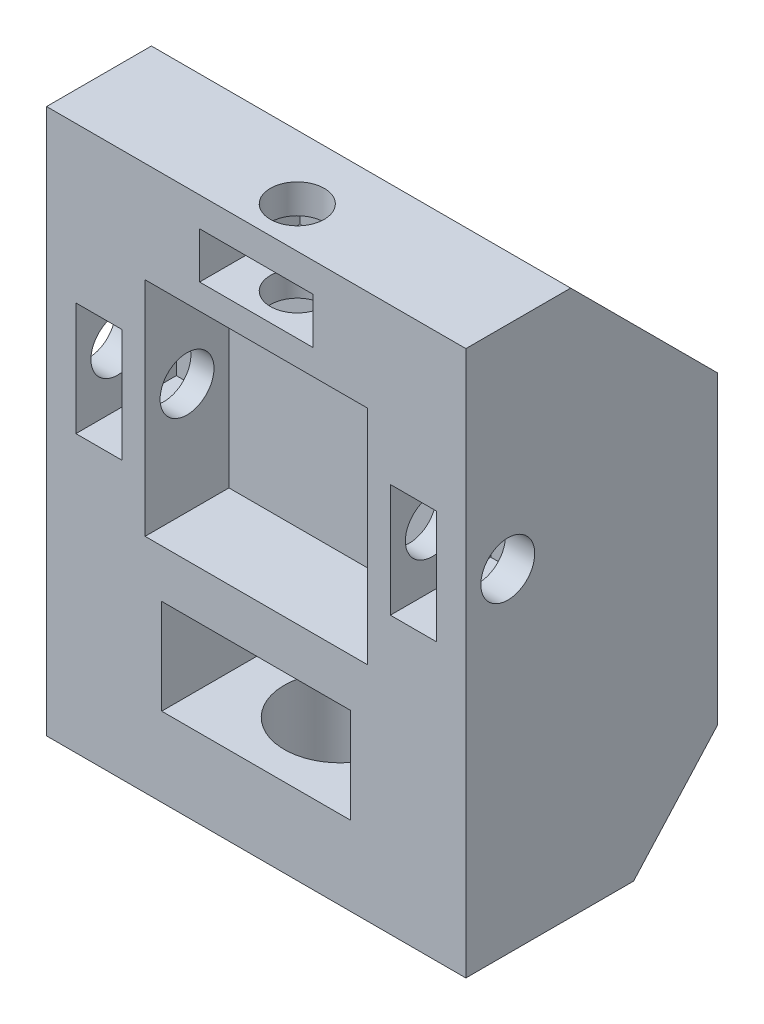
ISO-10303-21;
HEADER;
FILE_DESCRIPTION(('STEP AP214'),'2;1');
FILE_NAME('part.step','',(''),(''),'','','');
FILE_SCHEMA(('AUTOMOTIVE_DESIGN { 1 0 10303 214 1 1 1 1 }'));
ENDSEC;
DATA;
#1=APPLICATION_CONTEXT('core data for automotive mechanical design processes');
#2=APPLICATION_PROTOCOL_DEFINITION('international standard','automotive_design',2000,#1);
#3=PRODUCT_CONTEXT('',#1,'mechanical');
#4=PRODUCT('Part','Part','',(#3));
#5=PRODUCT_RELATED_PRODUCT_CATEGORY('part','',(#4));
#6=PRODUCT_DEFINITION_FORMATION('','',#4);
#7=PRODUCT_DEFINITION_CONTEXT('part definition',#1,'design');
#8=PRODUCT_DEFINITION('design','',#6,#7);
#9=PRODUCT_DEFINITION_SHAPE('','',#8);
#10=(LENGTH_UNIT() NAMED_UNIT(*) SI_UNIT(.MILLI.,.METRE.));
#11=(NAMED_UNIT(*) PLANE_ANGLE_UNIT() SI_UNIT($,.RADIAN.));
#12=(NAMED_UNIT(*) SI_UNIT($,.STERADIAN.) SOLID_ANGLE_UNIT());
#13=UNCERTAINTY_MEASURE_WITH_UNIT(LENGTH_MEASURE(1.E-05),#10,'distance_accuracy_value','');
#14=(GEOMETRIC_REPRESENTATION_CONTEXT(3) GLOBAL_UNCERTAINTY_ASSIGNED_CONTEXT((#13)) GLOBAL_UNIT_ASSIGNED_CONTEXT((#10,
#11,#12)) REPRESENTATION_CONTEXT('',''));
#15=CARTESIAN_POINT('',(0.,0.,0.));
#16=DIRECTION('',(0.,0.,1.));
#17=DIRECTION('',(1.,0.,0.));
#18=AXIS2_PLACEMENT_3D('',#15,#16,#17);
#19=CARTESIAN_POINT('',(12.7,3.67689972237439,12.7));
#20=DIRECTION('',(1.,0.,0.));
#21=DIRECTION('',(0.,0.,-1.));
#22=AXIS2_PLACEMENT_3D('',#19,#20,#21);
#23=CYLINDRICAL_SURFACE('',#22,1.63194999999999);
#24=CARTESIAN_POINT('',(-8.128,3.67689972237439,12.7));
#25=DIRECTION('',(1.,0.,0.));
#26=DIRECTION('',(0.,0.,-1.));
#27=AXIS2_PLACEMENT_3D('',#24,#25,#26);
#28=CIRCLE('',#27,1.63194999999999);
#29=CARTESIAN_POINT('',(-8.128,3.67689972237439,11.06805));
#30=VERTEX_POINT('',#29);
#31=EDGE_CURVE('E39',#30,#30,#28,.F.);
#32=ORIENTED_EDGE('',*,*,#31,.T.);
#33=EDGE_LOOP('',(#32));
#34=FACE_BOUND('',#33,.T.);
#35=CARTESIAN_POINT('',(-6.731,3.67689972237439,12.7));
#36=DIRECTION('',(-1.,0.,0.));
#37=DIRECTION('',(0.,0.,1.));
#38=AXIS2_PLACEMENT_3D('',#35,#36,#37);
#39=CIRCLE('',#38,1.63194999999999);
#40=CARTESIAN_POINT('',(-6.731,3.67689972237439,14.33195));
#41=VERTEX_POINT('',#40);
#42=EDGE_CURVE('E327',#41,#41,#39,.T.);
#43=ORIENTED_EDGE('',*,*,#42,.F.);
#44=EDGE_LOOP('',(#43));
#45=FACE_BOUND('',#44,.T.);
#46=ADVANCED_FACE('F35',(#34,#45),#23,.F.);
#47=CARTESIAN_POINT('',(10.922,3.67689972237439,12.7));
#48=DIRECTION('',(1.,0.,0.));
#49=DIRECTION('',(0.,0.,-1.));
#50=AXIS2_PLACEMENT_3D('',#47,#48,#49);
#51=CIRCLE('',#50,1.63194999999999);
#52=CARTESIAN_POINT('',(10.922,3.67689972237439,11.06805));
#53=VERTEX_POINT('',#52);
#54=EDGE_CURVE('E303',#53,#53,#51,.F.);
#55=ORIENTED_EDGE('',*,*,#54,.T.);
#56=EDGE_LOOP('',(#55));
#57=FACE_BOUND('',#56,.T.);
#58=CARTESIAN_POINT('',(12.7,3.67689972237439,12.7));
#59=DIRECTION('',(1.,0.,0.));
#60=DIRECTION('',(0.,0.,-1.));
#61=AXIS2_PLACEMENT_3D('',#58,#59,#60);
#62=CIRCLE('',#61,1.63194999999999);
#63=CARTESIAN_POINT('',(12.7,3.67689972237439,11.06805));
#64=VERTEX_POINT('',#63);
#65=EDGE_CURVE('E320',#64,#64,#62,.T.);
#66=ORIENTED_EDGE('',*,*,#65,.T.);
#67=EDGE_LOOP('',(#66));
#68=FACE_BOUND('',#67,.T.);
#69=ADVANCED_FACE('F485',(#57,#68),#23,.F.);
#70=CARTESIAN_POINT('',(0.,16.51,12.7522595707275));
#71=DIRECTION('',(0.,1.,0.));
#72=DIRECTION('',(0.,0.,1.));
#73=AXIS2_PLACEMENT_3D('',#70,#71,#72);
#74=CYLINDRICAL_SURFACE('',#73,1.63195);
#75=CARTESIAN_POINT('',(0.,11.938,12.7522595707275));
#76=DIRECTION('',(0.,-1.,0.));
#77=DIRECTION('',(0.,0.,-1.));
#78=AXIS2_PLACEMENT_3D('',#75,#76,#77);
#79=CIRCLE('',#78,1.63195);
#80=CARTESIAN_POINT('',(0.,11.938,11.1203095707275));
#81=VERTEX_POINT('',#80);
#82=EDGE_CURVE('E324',#81,#81,#79,.F.);
#83=ORIENTED_EDGE('',*,*,#82,.T.);
#84=EDGE_LOOP('',(#83));
#85=FACE_BOUND('',#84,.T.);
#86=CARTESIAN_POINT('',(0.,10.4078997223744,12.7522595707275));
#87=DIRECTION('',(0.,1.,0.));
#88=DIRECTION('',(-1.,0.,0.));
#89=AXIS2_PLACEMENT_3D('',#86,#87,#88);
#90=CIRCLE('',#89,1.63195);
#91=CARTESIAN_POINT('',(-1.63195,10.4078997223744,12.7522595707275));
#92=VERTEX_POINT('',#91);
#93=EDGE_CURVE('E336',#92,#92,#90,.T.);
#94=ORIENTED_EDGE('',*,*,#93,.F.);
#95=EDGE_LOOP('',(#94));
#96=FACE_BOUND('',#95,.T.);
#97=ADVANCED_FACE('F491',(#85,#96),#74,.F.);
#98=CARTESIAN_POINT('',(-12.7,-16.51,15.24));
#99=DIRECTION('',(1.,0.,0.));
#100=DIRECTION('',(0.,1.,0.));
#101=AXIS2_PLACEMENT_3D('',#98,#99,#100);
#102=PLANE('',#101);
#103=CARTESIAN_POINT('',(-12.7,3.67689972237439,12.7));
#104=DIRECTION('',(1.,0.,0.));
#105=DIRECTION('',(0.,0.,-1.));
#106=AXIS2_PLACEMENT_3D('',#103,#104,#105);
#107=CIRCLE('',#106,1.63194999999999);
#108=CARTESIAN_POINT('',(-12.7,3.67689972237439,11.06805));
#109=VERTEX_POINT('',#108);
#110=EDGE_CURVE('E323',#109,#109,#107,.T.);
#111=ORIENTED_EDGE('',*,*,#110,.T.);
#112=EDGE_LOOP('',(#111));
#113=FACE_BOUND('',#112,.T.);
#114=DIRECTION('',(0.,0.,-1.));
#115=VECTOR('',#114,1.);
#116=CARTESIAN_POINT('',(-12.7,16.51,15.24));
#117=LINE('',#116,#115);
#118=CARTESIAN_POINT('',(-12.7,16.51,15.24));
#119=VERTEX_POINT('',#118);
#120=CARTESIAN_POINT('',(-12.7,16.51,8.89));
#121=VERTEX_POINT('',#120);
#122=EDGE_CURVE('E416',#119,#121,#117,.T.);
#123=ORIENTED_EDGE('',*,*,#122,.T.);
#124=DIRECTION('',(0.,-0.707106781186549,-0.707106781186546));
#125=VECTOR('',#124,1.);
#126=CARTESIAN_POINT('',(-12.7,16.51,8.89));
#127=LINE('',#126,#125);
#128=CARTESIAN_POINT('',(-12.7,7.61999999999998,0.));
#129=VERTEX_POINT('',#128);
#130=EDGE_CURVE('E452',#121,#129,#127,.T.);
#131=ORIENTED_EDGE('',*,*,#130,.T.);
#132=DIRECTION('',(0.,-1.,0.));
#133=VECTOR('',#132,1.);
#134=CARTESIAN_POINT('',(-12.7,-16.51,0.));
#135=LINE('',#134,#133);
#136=CARTESIAN_POINT('',(-12.7,-10.8680884246676,0.));
#137=VERTEX_POINT('',#136);
#138=EDGE_CURVE('E399',#129,#137,#135,.T.);
#139=ORIENTED_EDGE('',*,*,#138,.T.);
#140=DIRECTION('',(0.,-0.743144825477398,0.669130606358854));
#141=VECTOR('',#140,1.);
#142=CARTESIAN_POINT('',(-12.7,-16.51,5.08000000000004));
#143=LINE('',#142,#141);
#144=CARTESIAN_POINT('',(-12.7,-16.51,5.08000000000004));
#145=VERTEX_POINT('',#144);
#146=EDGE_CURVE('E447',#137,#145,#143,.T.);
#147=ORIENTED_EDGE('',*,*,#146,.T.);
#148=DIRECTION('',(0.,0.,-1.));
#149=VECTOR('',#148,1.);
#150=CARTESIAN_POINT('',(-12.7,-16.51,15.24));
#151=LINE('',#150,#149);
#152=CARTESIAN_POINT('',(-12.7,-16.51,15.24));
#153=VERTEX_POINT('',#152);
#154=EDGE_CURVE('E428',#153,#145,#151,.T.);
#155=ORIENTED_EDGE('',*,*,#154,.F.);
#156=DIRECTION('',(0.,-1.,0.));
#157=VECTOR('',#156,1.);
#158=CARTESIAN_POINT('',(-12.7,-16.51,15.24));
#159=LINE('',#158,#157);
#160=EDGE_CURVE('E406',#119,#153,#159,.T.);
#161=ORIENTED_EDGE('',*,*,#160,.F.);
#162=EDGE_LOOP('',(#123,#131,#139,#147,#155,#161));
#163=FACE_BOUND('',#162,.T.);
#164=ADVANCED_FACE('F563',(#113,#163),#102,.F.);
#165=CARTESIAN_POINT('',(-12.7,-16.51,15.24));
#166=DIRECTION('',(0.,1.,0.));
#167=DIRECTION('',(0.,0.,1.));
#168=AXIS2_PLACEMENT_3D('',#165,#166,#167);
#169=PLANE('',#168);
#170=CARTESIAN_POINT('',(0.,-16.51,10.16));
#171=DIRECTION('',(0.,-1.,0.));
#172=DIRECTION('',(0.,0.,-1.));
#173=AXIS2_PLACEMENT_3D('',#170,#171,#172);
#174=CIRCLE('',#173,3.37819999999999);
#175=CARTESIAN_POINT('',(0.,-16.51,6.78180000000001));
#176=VERTEX_POINT('',#175);
#177=EDGE_CURVE('E339',#176,#176,#174,.T.);
#178=ORIENTED_EDGE('',*,*,#177,.F.);
#179=EDGE_LOOP('',(#178));
#180=FACE_BOUND('',#179,.T.);
#181=ORIENTED_EDGE('',*,*,#154,.T.);
#182=DIRECTION('',(1.,0.,0.));
#183=VECTOR('',#182,1.);
#184=CARTESIAN_POINT('',(12.7,-16.51,5.08000000000004));
#185=LINE('',#184,#183);
#186=CARTESIAN_POINT('',(12.7,-16.51,5.08000000000004));
#187=VERTEX_POINT('',#186);
#188=EDGE_CURVE('E431',#145,#187,#185,.T.);
#189=ORIENTED_EDGE('',*,*,#188,.T.);
#190=DIRECTION('',(0.,0.,-1.));
#191=VECTOR('',#190,1.);
#192=CARTESIAN_POINT('',(12.7,-16.51,15.24));
#193=LINE('',#192,#191);
#194=CARTESIAN_POINT('',(12.7,-16.51,15.24));
#195=VERTEX_POINT('',#194);
#196=EDGE_CURVE('E425',#195,#187,#193,.T.);
#197=ORIENTED_EDGE('',*,*,#196,.F.);
#198=DIRECTION('',(1.,0.,0.));
#199=VECTOR('',#198,1.);
#200=CARTESIAN_POINT('',(-12.7,-16.51,15.24));
#201=LINE('',#200,#199);
#202=EDGE_CURVE('E409',#153,#195,#201,.T.);
#203=ORIENTED_EDGE('',*,*,#202,.F.);
#204=EDGE_LOOP('',(#181,#189,#197,#203));
#205=FACE_BOUND('',#204,.T.);
#206=ADVANCED_FACE('F559',(#180,#205),#169,.F.);
#207=CARTESIAN_POINT('',(12.7,-16.51,15.24));
#208=DIRECTION('',(-1.,0.,0.));
#209=DIRECTION('',(0.,-1.,0.));
#210=AXIS2_PLACEMENT_3D('',#207,#208,#209);
#211=PLANE('',#210);
#212=ORIENTED_EDGE('',*,*,#65,.F.);
#213=EDGE_LOOP('',(#212));
#214=FACE_BOUND('',#213,.T.);
#215=DIRECTION('',(0.,1.,0.));
#216=VECTOR('',#215,1.);
#217=CARTESIAN_POINT('',(12.7,-16.51,0.));
#218=LINE('',#217,#216);
#219=CARTESIAN_POINT('',(12.7,-10.8680884246676,0.));
#220=VERTEX_POINT('',#219);
#221=CARTESIAN_POINT('',(12.7,7.61999999999998,0.));
#222=VERTEX_POINT('',#221);
#223=EDGE_CURVE('E410',#220,#222,#218,.T.);
#224=ORIENTED_EDGE('',*,*,#223,.T.);
#225=DIRECTION('',(0.,0.707106781186549,0.707106781186546));
#226=VECTOR('',#225,1.);
#227=CARTESIAN_POINT('',(12.7,16.51,8.89));
#228=LINE('',#227,#226);
#229=CARTESIAN_POINT('',(12.7,16.51,8.89));
#230=VERTEX_POINT('',#229);
#231=EDGE_CURVE('E11',#222,#230,#228,.T.);
#232=ORIENTED_EDGE('',*,*,#231,.T.);
#233=DIRECTION('',(0.,0.,-1.));
#234=VECTOR('',#233,1.);
#235=CARTESIAN_POINT('',(12.7,16.51,15.24));
#236=LINE('',#235,#234);
#237=CARTESIAN_POINT('',(12.7,16.51,15.24));
#238=VERTEX_POINT('',#237);
#239=EDGE_CURVE('E422',#238,#230,#236,.T.);
#240=ORIENTED_EDGE('',*,*,#239,.F.);
#241=DIRECTION('',(0.,1.,0.));
#242=VECTOR('',#241,1.);
#243=CARTESIAN_POINT('',(12.7,-16.51,15.24));
#244=LINE('',#243,#242);
#245=EDGE_CURVE('E412',#195,#238,#244,.T.);
#246=ORIENTED_EDGE('',*,*,#245,.F.);
#247=ORIENTED_EDGE('',*,*,#196,.T.);
#248=DIRECTION('',(0.,0.743144825477398,-0.669130606358854));
#249=VECTOR('',#248,1.);
#250=CARTESIAN_POINT('',(12.7,-16.51,5.08000000000004));
#251=LINE('',#250,#249);
#252=EDGE_CURVE('E434',#187,#220,#251,.T.);
#253=ORIENTED_EDGE('',*,*,#252,.T.);
#254=EDGE_LOOP('',(#224,#232,#240,#246,#247,#253));
#255=FACE_BOUND('',#254,.T.);
#256=ADVANCED_FACE('F555',(#214,#255),#211,.F.);
#257=CARTESIAN_POINT('',(-12.7,16.51,15.24));
#258=DIRECTION('',(0.,-1.,0.));
#259=DIRECTION('',(0.,0.,-1.));
#260=AXIS2_PLACEMENT_3D('',#257,#258,#259);
#261=PLANE('',#260);
#262=CARTESIAN_POINT('',(0.,16.51,12.7522595707275));
#263=DIRECTION('',(0.,1.,0.));
#264=DIRECTION('',(0.,0.,1.));
#265=AXIS2_PLACEMENT_3D('',#262,#263,#264);
#266=CIRCLE('',#265,1.63195);
#267=CARTESIAN_POINT('',(0.,16.51,14.3842095707275));
#268=VERTEX_POINT('',#267);
#269=EDGE_CURVE('E333',#268,#268,#266,.T.);
#270=ORIENTED_EDGE('',*,*,#269,.F.);
#271=EDGE_LOOP('',(#270));
#272=FACE_BOUND('',#271,.T.);
#273=ORIENTED_EDGE('',*,*,#239,.T.);
#274=DIRECTION('',(-1.,0.,0.));
#275=VECTOR('',#274,1.);
#276=CARTESIAN_POINT('',(-12.7,16.51,8.89));
#277=LINE('',#276,#275);
#278=EDGE_CURVE('E449',#230,#121,#277,.T.);
#279=ORIENTED_EDGE('',*,*,#278,.T.);
#280=ORIENTED_EDGE('',*,*,#122,.F.);
#281=DIRECTION('',(-1.,0.,0.));
#282=VECTOR('',#281,1.);
#283=CARTESIAN_POINT('',(-12.7,16.51,15.24));
#284=LINE('',#283,#282);
#285=EDGE_CURVE('E414',#238,#119,#284,.T.);
#286=ORIENTED_EDGE('',*,*,#285,.F.);
#287=EDGE_LOOP('',(#273,#279,#280,#286));
#288=FACE_BOUND('',#287,.T.);
#289=ADVANCED_FACE('F548',(#272,#288),#261,.F.);
#290=CARTESIAN_POINT('',(0.,0.,15.24));
#291=DIRECTION('',(0.,0.,-1.));
#292=DIRECTION('',(-1.,0.,0.));
#293=AXIS2_PLACEMENT_3D('',#290,#291,#292);
#294=PLANE('',#293);
#295=DIRECTION('',(-1.,0.,0.));
#296=VECTOR('',#295,1.);
#297=CARTESIAN_POINT('',(-10.922,7.09605718062982,15.24));
#298=LINE('',#297,#296);
#299=CARTESIAN_POINT('',(-8.128,7.09605718062982,15.24));
#300=VERTEX_POINT('',#299);
#301=CARTESIAN_POINT('',(-10.922,7.09605718062982,15.24));
#302=VERTEX_POINT('',#301);
#303=EDGE_CURVE('E245',#300,#302,#298,.T.);
#304=ORIENTED_EDGE('',*,*,#303,.F.);
#305=DIRECTION('',(0.,1.,0.));
#306=VECTOR('',#305,1.);
#307=CARTESIAN_POINT('',(-8.128,0.238057180629819,15.24));
#308=LINE('',#307,#306);
#309=CARTESIAN_POINT('',(-8.128,0.238057180629819,15.24));
#310=VERTEX_POINT('',#309);
#311=EDGE_CURVE('E52',#310,#300,#308,.T.);
#312=ORIENTED_EDGE('',*,*,#311,.F.);
#313=DIRECTION('',(1.,0.,0.));
#314=VECTOR('',#313,1.);
#315=CARTESIAN_POINT('',(-10.922,0.238057180629819,15.24));
#316=LINE('',#315,#314);
#317=CARTESIAN_POINT('',(-10.922,0.238057180629819,15.24));
#318=VERTEX_POINT('',#317);
#319=EDGE_CURVE('E236',#318,#310,#316,.T.);
#320=ORIENTED_EDGE('',*,*,#319,.F.);
#321=DIRECTION('',(0.,-1.,0.));
#322=VECTOR('',#321,1.);
#323=CARTESIAN_POINT('',(-10.922,0.238057180629819,15.24));
#324=LINE('',#323,#322);
#325=EDGE_CURVE('E239',#302,#318,#324,.T.);
#326=ORIENTED_EDGE('',*,*,#325,.F.);
#327=EDGE_LOOP('',(#304,#312,#320,#326));
#328=FACE_BOUND('',#327,.T.);
#329=DIRECTION('',(-1.,0.,0.));
#330=VECTOR('',#329,1.);
#331=CARTESIAN_POINT('',(8.12800000000001,7.09605718062982,15.24));
#332=LINE('',#331,#330);
#333=CARTESIAN_POINT('',(10.922,7.09605718062982,15.24));
#334=VERTEX_POINT('',#333);
#335=CARTESIAN_POINT('',(8.12800000000001,7.09605718062982,15.24));
#336=VERTEX_POINT('',#335);
#337=EDGE_CURVE('E270',#334,#336,#332,.T.);
#338=ORIENTED_EDGE('',*,*,#337,.F.);
#339=DIRECTION('',(0.,1.,0.));
#340=VECTOR('',#339,1.);
#341=CARTESIAN_POINT('',(10.922,0.238057180629819,15.24));
#342=LINE('',#341,#340);
#343=CARTESIAN_POINT('',(10.922,0.238057180629819,15.24));
#344=VERTEX_POINT('',#343);
#345=EDGE_CURVE('E60',#344,#334,#342,.T.);
#346=ORIENTED_EDGE('',*,*,#345,.F.);
#347=DIRECTION('',(1.,0.,0.));
#348=VECTOR('',#347,1.);
#349=CARTESIAN_POINT('',(8.12800000000001,0.238057180629819,15.24));
#350=LINE('',#349,#348);
#351=CARTESIAN_POINT('',(8.12800000000001,0.238057180629819,15.24));
#352=VERTEX_POINT('',#351);
#353=EDGE_CURVE('E259',#352,#344,#350,.T.);
#354=ORIENTED_EDGE('',*,*,#353,.F.);
#355=DIRECTION('',(0.,-1.,0.));
#356=VECTOR('',#355,1.);
#357=CARTESIAN_POINT('',(8.12800000000001,0.238057180629819,15.24));
#358=LINE('',#357,#356);
#359=EDGE_CURVE('E273',#336,#352,#358,.T.);
#360=ORIENTED_EDGE('',*,*,#359,.F.);
#361=EDGE_LOOP('',(#338,#346,#354,#360));
#362=FACE_BOUND('',#361,.T.);
#363=DIRECTION('',(-1.,0.,0.));
#364=VECTOR('',#363,1.);
#365=CARTESIAN_POINT('',(-3.42899999999999,14.732,15.24));
#366=LINE('',#365,#364);
#367=CARTESIAN_POINT('',(3.42900000000001,14.732,15.24));
#368=VERTEX_POINT('',#367);
#369=CARTESIAN_POINT('',(-3.42899999999999,14.732,15.24));
#370=VERTEX_POINT('',#369);
#371=EDGE_CURVE('E302',#368,#370,#366,.T.);
#372=ORIENTED_EDGE('',*,*,#371,.F.);
#373=DIRECTION('',(0.,1.,0.));
#374=VECTOR('',#373,1.);
#375=CARTESIAN_POINT('',(3.42900000000001,11.938,15.24));
#376=LINE('',#375,#374);
#377=CARTESIAN_POINT('',(3.42900000000001,11.938,15.24));
#378=VERTEX_POINT('',#377);
#379=EDGE_CURVE('E300',#378,#368,#376,.T.);
#380=ORIENTED_EDGE('',*,*,#379,.F.);
#381=DIRECTION('',(1.,0.,0.));
#382=VECTOR('',#381,1.);
#383=CARTESIAN_POINT('',(-3.42899999999999,11.938,15.24));
#384=LINE('',#383,#382);
#385=CARTESIAN_POINT('',(-3.42899999999999,11.938,15.24));
#386=VERTEX_POINT('',#385);
#387=EDGE_CURVE('E290',#386,#378,#384,.T.);
#388=ORIENTED_EDGE('',*,*,#387,.F.);
#389=DIRECTION('',(0.,-1.,0.));
#390=VECTOR('',#389,1.);
#391=CARTESIAN_POINT('',(-3.42899999999999,11.938,15.24));
#392=LINE('',#391,#390);
#393=EDGE_CURVE('E306',#370,#386,#392,.T.);
#394=ORIENTED_EDGE('',*,*,#393,.F.);
#395=EDGE_LOOP('',(#372,#380,#388,#394));
#396=FACE_BOUND('',#395,.T.);
#397=DIRECTION('',(-1.,0.,0.));
#398=VECTOR('',#397,1.);
#399=CARTESIAN_POINT('',(-5.72652120523289,-5.96281055176047,15.24));
#400=LINE('',#399,#398);
#401=CARTESIAN_POINT('',(5.72652120523289,-5.96281055176047,15.24));
#402=VERTEX_POINT('',#401);
#403=CARTESIAN_POINT('',(-5.72652120523289,-5.96281055176047,15.24));
#404=VERTEX_POINT('',#403);
#405=EDGE_CURVE('E357',#402,#404,#400,.T.);
#406=ORIENTED_EDGE('',*,*,#405,.F.);
#407=DIRECTION('',(0.,1.,0.));
#408=VECTOR('',#407,1.);
#409=CARTESIAN_POINT('',(5.72652120523289,-5.96281055176047,15.24));
#410=LINE('',#409,#408);
#411=CARTESIAN_POINT('',(5.72652120523289,-11.72534761363,15.24));
#412=VERTEX_POINT('',#411);
#413=EDGE_CURVE('E345',#412,#402,#410,.T.);
#414=ORIENTED_EDGE('',*,*,#413,.F.);
#415=DIRECTION('',(1.,0.,0.));
#416=VECTOR('',#415,1.);
#417=CARTESIAN_POINT('',(-5.72652120523289,-11.72534761363,15.24));
#418=LINE('',#417,#416);
#419=CARTESIAN_POINT('',(-5.72652120523289,-11.72534761363,15.24));
#420=VERTEX_POINT('',#419);
#421=EDGE_CURVE('E349',#420,#412,#418,.T.);
#422=ORIENTED_EDGE('',*,*,#421,.F.);
#423=DIRECTION('',(0.,-1.,0.));
#424=VECTOR('',#423,1.);
#425=CARTESIAN_POINT('',(-5.72652120523289,-5.96281055176047,15.24));
#426=LINE('',#425,#424);
#427=EDGE_CURVE('E360',#404,#420,#426,.T.);
#428=ORIENTED_EDGE('',*,*,#427,.F.);
#429=EDGE_LOOP('',(#406,#414,#422,#428));
#430=FACE_BOUND('',#429,.T.);
#431=DIRECTION('',(-1.,0.,0.));
#432=VECTOR('',#431,1.);
#433=CARTESIAN_POINT('',(-6.731,10.4078997223744,15.24));
#434=LINE('',#433,#432);
#435=CARTESIAN_POINT('',(6.731,10.4078997223744,15.24));
#436=VERTEX_POINT('',#435);
#437=CARTESIAN_POINT('',(-6.731,10.4078997223744,15.24));
#438=VERTEX_POINT('',#437);
#439=EDGE_CURVE('E389',#436,#438,#434,.T.);
#440=ORIENTED_EDGE('',*,*,#439,.F.);
#441=DIRECTION('',(0.,1.,0.));
#442=VECTOR('',#441,1.);
#443=CARTESIAN_POINT('',(6.731,-3.05410027762562,15.24));
#444=LINE('',#443,#442);
#445=CARTESIAN_POINT('',(6.731,-3.05410027762562,15.24));
#446=VERTEX_POINT('',#445);
#447=EDGE_CURVE('E367',#446,#436,#444,.T.);
#448=ORIENTED_EDGE('',*,*,#447,.F.);
#449=DIRECTION('',(1.,0.,0.));
#450=VECTOR('',#449,1.);
#451=CARTESIAN_POINT('',(-6.731,-3.05410027762562,15.24));
#452=LINE('',#451,#450);
#453=CARTESIAN_POINT('',(-6.731,-3.05410027762562,15.24));
#454=VERTEX_POINT('',#453);
#455=EDGE_CURVE('E378',#454,#446,#452,.T.);
#456=ORIENTED_EDGE('',*,*,#455,.F.);
#457=DIRECTION('',(0.,-1.,0.));
#458=VECTOR('',#457,1.);
#459=CARTESIAN_POINT('',(-6.731,-3.05410027762562,15.24));
#460=LINE('',#459,#458);
#461=EDGE_CURVE('E392',#438,#454,#460,.T.);
#462=ORIENTED_EDGE('',*,*,#461,.F.);
#463=EDGE_LOOP('',(#440,#448,#456,#462));
#464=FACE_BOUND('',#463,.T.);
#465=ORIENTED_EDGE('',*,*,#160,.T.);
#466=ORIENTED_EDGE('',*,*,#202,.T.);
#467=ORIENTED_EDGE('',*,*,#245,.T.);
#468=ORIENTED_EDGE('',*,*,#285,.T.);
#469=EDGE_LOOP('',(#465,#466,#467,#468));
#470=FACE_BOUND('',#469,.T.);
#471=ADVANCED_FACE('F524',(#328,#362,#396,#430,#464,#470),#294,.F.);
#472=CARTESIAN_POINT('',(0.,0.,0.));
#473=DIRECTION('',(0.,0.,-1.));
#474=DIRECTION('',(-1.,0.,0.));
#475=AXIS2_PLACEMENT_3D('',#472,#473,#474);
#476=PLANE('',#475);
#477=ORIENTED_EDGE('',*,*,#138,.F.);
#478=DIRECTION('',(1.,0.,0.));
#479=VECTOR('',#478,1.);
#480=CARTESIAN_POINT('',(12.7,7.61999999999998,0.));
#481=LINE('',#480,#479);
#482=EDGE_CURVE('E44',#129,#222,#481,.T.);
#483=ORIENTED_EDGE('',*,*,#482,.T.);
#484=ORIENTED_EDGE('',*,*,#223,.F.);
#485=DIRECTION('',(-1.,0.,0.));
#486=VECTOR('',#485,1.);
#487=CARTESIAN_POINT('',(-12.7,-10.8680884246676,0.));
#488=LINE('',#487,#486);
#489=CARTESIAN_POINT('',(5.72652120523289,-10.8680884246676,0.));
#490=VERTEX_POINT('',#489);
#491=EDGE_CURVE('E439',#220,#490,#488,.T.);
#492=ORIENTED_EDGE('',*,*,#491,.T.);
#493=DIRECTION('',(0.,1.,0.));
#494=VECTOR('',#493,1.);
#495=CARTESIAN_POINT('',(5.72652120523289,-5.96281055176047,0.));
#496=LINE('',#495,#494);
#497=CARTESIAN_POINT('',(5.72652120523289,-5.96281055176047,0.));
#498=VERTEX_POINT('',#497);
#499=EDGE_CURVE('E346',#490,#498,#496,.T.);
#500=ORIENTED_EDGE('',*,*,#499,.T.);
#501=DIRECTION('',(-1.,0.,0.));
#502=VECTOR('',#501,1.);
#503=CARTESIAN_POINT('',(-5.72652120523289,-5.96281055176047,0.));
#504=LINE('',#503,#502);
#505=CARTESIAN_POINT('',(-5.72652120523289,-5.96281055176047,0.));
#506=VERTEX_POINT('',#505);
#507=EDGE_CURVE('E348',#498,#506,#504,.T.);
#508=ORIENTED_EDGE('',*,*,#507,.T.);
#509=DIRECTION('',(0.,-1.,0.));
#510=VECTOR('',#509,1.);
#511=CARTESIAN_POINT('',(-5.72652120523289,-5.96281055176047,0.));
#512=LINE('',#511,#510);
#513=CARTESIAN_POINT('',(-5.72652120523289,-10.8680884246676,0.));
#514=VERTEX_POINT('',#513);
#515=EDGE_CURVE('E352',#506,#514,#512,.T.);
#516=ORIENTED_EDGE('',*,*,#515,.T.);
#517=DIRECTION('',(-1.,0.,0.));
#518=VECTOR('',#517,1.);
#519=CARTESIAN_POINT('',(-12.7,-10.8680884246676,0.));
#520=LINE('',#519,#518);
#521=EDGE_CURVE('E436',#514,#137,#520,.T.);
#522=ORIENTED_EDGE('',*,*,#521,.T.);
#523=EDGE_LOOP('',(#477,#483,#484,#492,#500,#508,#516,#522));
#524=FACE_BOUND('',#523,.T.);
#525=ADVANCED_FACE('F513',(#524),#476,.T.);
#526=CARTESIAN_POINT('',(6.731,-3.05410027762562,10.16));
#527=DIRECTION('',(1.,0.,0.));
#528=DIRECTION('',(0.,0.,-1.));
#529=AXIS2_PLACEMENT_3D('',#526,#527,#528);
#530=PLANE('',#529);
#531=CARTESIAN_POINT('',(6.731,3.67689972237439,12.7));
#532=DIRECTION('',(1.,0.,0.));
#533=DIRECTION('',(0.,0.,-1.));
#534=AXIS2_PLACEMENT_3D('',#531,#532,#533);
#535=CIRCLE('',#534,1.63194999999999);
#536=CARTESIAN_POINT('',(6.731,3.67689972237439,11.06805));
#537=VERTEX_POINT('',#536);
#538=EDGE_CURVE('E330',#537,#537,#535,.T.);
#539=ORIENTED_EDGE('',*,*,#538,.T.);
#540=EDGE_LOOP('',(#539));
#541=FACE_BOUND('',#540,.T.);
#542=ORIENTED_EDGE('',*,*,#447,.T.);
#543=DIRECTION('',(0.,0.,1.));
#544=VECTOR('',#543,1.);
#545=CARTESIAN_POINT('',(6.731,10.4078997223744,10.16));
#546=LINE('',#545,#544);
#547=CARTESIAN_POINT('',(6.731,10.4078997223744,10.16));
#548=VERTEX_POINT('',#547);
#549=EDGE_CURVE('E387',#548,#436,#546,.T.);
#550=ORIENTED_EDGE('',*,*,#549,.F.);
#551=DIRECTION('',(0.,1.,0.));
#552=VECTOR('',#551,1.);
#553=CARTESIAN_POINT('',(6.731,-3.05410027762562,10.16));
#554=LINE('',#553,#552);
#555=CARTESIAN_POINT('',(6.731,-3.05410027762562,10.16));
#556=VERTEX_POINT('',#555);
#557=EDGE_CURVE('E374',#556,#548,#554,.T.);
#558=ORIENTED_EDGE('',*,*,#557,.F.);
#559=DIRECTION('',(0.,0.,1.));
#560=VECTOR('',#559,1.);
#561=CARTESIAN_POINT('',(6.731,-3.05410027762562,10.16));
#562=LINE('',#561,#560);
#563=EDGE_CURVE('E397',#556,#446,#562,.T.);
#564=ORIENTED_EDGE('',*,*,#563,.T.);
#565=EDGE_LOOP('',(#542,#550,#558,#564));
#566=FACE_BOUND('',#565,.T.);
#567=ADVANCED_FACE('F509',(#541,#566),#530,.F.);
#568=CARTESIAN_POINT('',(-6.731,-3.05410027762562,10.16));
#569=DIRECTION('',(0.,-1.,0.));
#570=DIRECTION('',(0.,0.,-1.));
#571=AXIS2_PLACEMENT_3D('',#568,#569,#570);
#572=PLANE('',#571);
#573=ORIENTED_EDGE('',*,*,#455,.T.);
#574=ORIENTED_EDGE('',*,*,#563,.F.);
#575=DIRECTION('',(1.,0.,0.));
#576=VECTOR('',#575,1.);
#577=CARTESIAN_POINT('',(-6.731,-3.05410027762562,10.16));
#578=LINE('',#577,#576);
#579=CARTESIAN_POINT('',(-6.731,-3.05410027762562,10.16));
#580=VERTEX_POINT('',#579);
#581=EDGE_CURVE('E384',#580,#556,#578,.T.);
#582=ORIENTED_EDGE('',*,*,#581,.F.);
#583=DIRECTION('',(0.,0.,1.));
#584=VECTOR('',#583,1.);
#585=CARTESIAN_POINT('',(-6.731,-3.05410027762562,10.16));
#586=LINE('',#585,#584);
#587=EDGE_CURVE('E400',#580,#454,#586,.T.);
#588=ORIENTED_EDGE('',*,*,#587,.T.);
#589=EDGE_LOOP('',(#573,#574,#582,#588));
#590=FACE_BOUND('',#589,.T.);
#591=ADVANCED_FACE('F512',(#590),#572,.F.);
#592=CARTESIAN_POINT('',(-6.731,-3.05410027762562,10.16));
#593=DIRECTION('',(-1.,0.,0.));
#594=DIRECTION('',(0.,0.,1.));
#595=AXIS2_PLACEMENT_3D('',#592,#593,#594);
#596=PLANE('',#595);
#597=ORIENTED_EDGE('',*,*,#42,.T.);
#598=EDGE_LOOP('',(#597));
#599=FACE_BOUND('',#598,.T.);
#600=ORIENTED_EDGE('',*,*,#461,.T.);
#601=ORIENTED_EDGE('',*,*,#587,.F.);
#602=DIRECTION('',(0.,-1.,0.));
#603=VECTOR('',#602,1.);
#604=CARTESIAN_POINT('',(-6.731,-3.05410027762562,10.16));
#605=LINE('',#604,#603);
#606=CARTESIAN_POINT('',(-6.731,10.4078997223744,10.16));
#607=VERTEX_POINT('',#606);
#608=EDGE_CURVE('E381',#607,#580,#605,.T.);
#609=ORIENTED_EDGE('',*,*,#608,.F.);
#610=DIRECTION('',(0.,0.,1.));
#611=VECTOR('',#610,1.);
#612=CARTESIAN_POINT('',(-6.731,10.4078997223744,10.16));
#613=LINE('',#612,#611);
#614=EDGE_CURVE('E402',#607,#438,#613,.T.);
#615=ORIENTED_EDGE('',*,*,#614,.T.);
#616=EDGE_LOOP('',(#600,#601,#609,#615));
#617=FACE_BOUND('',#616,.T.);
#618=ADVANCED_FACE('F527',(#599,#617),#596,.F.);
#619=CARTESIAN_POINT('',(-6.731,10.4078997223744,10.16));
#620=DIRECTION('',(0.,1.,0.));
#621=DIRECTION('',(-1.,0.,0.));
#622=AXIS2_PLACEMENT_3D('',#619,#620,#621);
#623=PLANE('',#622);
#624=ORIENTED_EDGE('',*,*,#93,.T.);
#625=EDGE_LOOP('',(#624));
#626=FACE_BOUND('',#625,.T.);
#627=ORIENTED_EDGE('',*,*,#439,.T.);
#628=ORIENTED_EDGE('',*,*,#614,.F.);
#629=DIRECTION('',(-1.,0.,0.));
#630=VECTOR('',#629,1.);
#631=CARTESIAN_POINT('',(-6.731,10.4078997223744,10.16));
#632=LINE('',#631,#630);
#633=EDGE_CURVE('E377',#548,#607,#632,.T.);
#634=ORIENTED_EDGE('',*,*,#633,.F.);
#635=ORIENTED_EDGE('',*,*,#549,.T.);
#636=EDGE_LOOP('',(#627,#628,#634,#635));
#637=FACE_BOUND('',#636,.T.);
#638=ADVANCED_FACE('F522',(#626,#637),#623,.F.);
#639=CARTESIAN_POINT('',(0.,0.,10.16));
#640=DIRECTION('',(0.,0.,-1.));
#641=DIRECTION('',(-1.,0.,0.));
#642=AXIS2_PLACEMENT_3D('',#639,#640,#641);
#643=PLANE('',#642);
#644=ORIENTED_EDGE('',*,*,#557,.T.);
#645=ORIENTED_EDGE('',*,*,#633,.T.);
#646=ORIENTED_EDGE('',*,*,#608,.T.);
#647=ORIENTED_EDGE('',*,*,#581,.T.);
#648=EDGE_LOOP('',(#644,#645,#646,#647));
#649=FACE_BOUND('',#648,.T.);
#650=ADVANCED_FACE('F531',(#649),#643,.F.);
#651=CARTESIAN_POINT('',(5.72652120523289,-5.96281055176047,0.));
#652=DIRECTION('',(1.,0.,0.));
#653=DIRECTION('',(0.,0.,-1.));
#654=AXIS2_PLACEMENT_3D('',#651,#652,#653);
#655=PLANE('',#654);
#656=ORIENTED_EDGE('',*,*,#499,.F.);
#657=DIRECTION('',(0.,-0.743144825477398,0.669130606358854));
#658=VECTOR('',#657,1.);
#659=CARTESIAN_POINT('',(5.72652120523289,-16.51,5.08000000000004));
#660=LINE('',#659,#658);
#661=CARTESIAN_POINT('',(5.72652120523289,-11.72534761363,0.771879640753268));
#662=VERTEX_POINT('',#661);
#663=EDGE_CURVE('E441',#490,#662,#660,.T.);
#664=ORIENTED_EDGE('',*,*,#663,.T.);
#665=DIRECTION('',(0.,0.,1.));
#666=VECTOR('',#665,1.);
#667=CARTESIAN_POINT('',(5.72652120523289,-11.72534761363,0.));
#668=LINE('',#667,#666);
#669=EDGE_CURVE('E365',#662,#412,#668,.T.);
#670=ORIENTED_EDGE('',*,*,#669,.T.);
#671=ORIENTED_EDGE('',*,*,#413,.T.);
#672=DIRECTION('',(0.,0.,1.));
#673=VECTOR('',#672,1.);
#674=CARTESIAN_POINT('',(5.72652120523289,-5.96281055176047,0.));
#675=LINE('',#674,#673);
#676=EDGE_CURVE('E355',#498,#402,#675,.T.);
#677=ORIENTED_EDGE('',*,*,#676,.F.);
#678=EDGE_LOOP('',(#656,#664,#670,#671,#677));
#679=FACE_BOUND('',#678,.T.);
#680=ADVANCED_FACE('F587',(#679),#655,.F.);
#681=CARTESIAN_POINT('',(-5.72652120523289,-11.72534761363,0.));
#682=DIRECTION('',(0.,-1.,0.));
#683=DIRECTION('',(0.,0.,-1.));
#684=AXIS2_PLACEMENT_3D('',#681,#682,#683);
#685=PLANE('',#684);
#686=CARTESIAN_POINT('',(0.,-11.72534761363,10.16));
#687=DIRECTION('',(0.,-1.,0.));
#688=DIRECTION('',(0.,0.,-1.));
#689=AXIS2_PLACEMENT_3D('',#686,#687,#688);
#690=CIRCLE('',#689,3.37819999999999);
#691=CARTESIAN_POINT('',(0.,-11.72534761363,6.78180000000001));
#692=VERTEX_POINT('',#691);
#693=EDGE_CURVE('E342',#692,#692,#690,.T.);
#694=ORIENTED_EDGE('',*,*,#693,.T.);
#695=EDGE_LOOP('',(#694));
#696=FACE_BOUND('',#695,.T.);
#697=ORIENTED_EDGE('',*,*,#669,.F.);
#698=DIRECTION('',(-1.,0.,0.));
#699=VECTOR('',#698,1.);
#700=CARTESIAN_POINT('',(-12.7,-11.72534761363,0.771879640753268));
#701=LINE('',#700,#699);
#702=CARTESIAN_POINT('',(-5.72652120523289,-11.72534761363,0.771879640753267));
#703=VERTEX_POINT('',#702);
#704=EDGE_CURVE('E443',#662,#703,#701,.T.);
#705=ORIENTED_EDGE('',*,*,#704,.T.);
#706=DIRECTION('',(0.,0.,1.));
#707=VECTOR('',#706,1.);
#708=CARTESIAN_POINT('',(-5.72652120523289,-11.72534761363,0.));
#709=LINE('',#708,#707);
#710=EDGE_CURVE('E368',#703,#420,#709,.T.);
#711=ORIENTED_EDGE('',*,*,#710,.T.);
#712=ORIENTED_EDGE('',*,*,#421,.T.);
#713=EDGE_LOOP('',(#697,#705,#711,#712));
#714=FACE_BOUND('',#713,.T.);
#715=ADVANCED_FACE('F590',(#696,#714),#685,.F.);
#716=CARTESIAN_POINT('',(-5.72652120523289,-5.96281055176047,0.));
#717=DIRECTION('',(-1.,0.,0.));
#718=DIRECTION('',(0.,0.,1.));
#719=AXIS2_PLACEMENT_3D('',#716,#717,#718);
#720=PLANE('',#719);
#721=ORIENTED_EDGE('',*,*,#710,.F.);
#722=DIRECTION('',(0.,0.743144825477398,-0.669130606358854));
#723=VECTOR('',#722,1.);
#724=CARTESIAN_POINT('',(-5.72652120523289,-16.51,5.08000000000004));
#725=LINE('',#724,#723);
#726=EDGE_CURVE('E445',#703,#514,#725,.T.);
#727=ORIENTED_EDGE('',*,*,#726,.T.);
#728=ORIENTED_EDGE('',*,*,#515,.F.);
#729=DIRECTION('',(0.,0.,1.));
#730=VECTOR('',#729,1.);
#731=CARTESIAN_POINT('',(-5.72652120523289,-5.96281055176047,0.));
#732=LINE('',#731,#730);
#733=EDGE_CURVE('E370',#506,#404,#732,.T.);
#734=ORIENTED_EDGE('',*,*,#733,.T.);
#735=ORIENTED_EDGE('',*,*,#427,.T.);
#736=EDGE_LOOP('',(#721,#727,#728,#734,#735));
#737=FACE_BOUND('',#736,.T.);
#738=ADVANCED_FACE('F577',(#737),#720,.F.);
#739=CARTESIAN_POINT('',(-5.72652120523289,-5.96281055176047,0.));
#740=DIRECTION('',(0.,1.,0.));
#741=DIRECTION('',(0.,0.,1.));
#742=AXIS2_PLACEMENT_3D('',#739,#740,#741);
#743=PLANE('',#742);
#744=ORIENTED_EDGE('',*,*,#405,.T.);
#745=ORIENTED_EDGE('',*,*,#733,.F.);
#746=ORIENTED_EDGE('',*,*,#507,.F.);
#747=ORIENTED_EDGE('',*,*,#676,.T.);
#748=EDGE_LOOP('',(#744,#745,#746,#747));
#749=FACE_BOUND('',#748,.T.);
#750=ADVANCED_FACE('F569',(#749),#743,.F.);
#751=CARTESIAN_POINT('',(-12.7,-16.51,5.08000000000004));
#752=DIRECTION('',(0.,-0.669130606358854,-0.743144825477398));
#753=DIRECTION('',(-1.,0.,0.));
#754=AXIS2_PLACEMENT_3D('',#751,#752,#753);
#755=PLANE('',#754);
#756=ORIENTED_EDGE('',*,*,#663,.F.);
#757=ORIENTED_EDGE('',*,*,#491,.F.);
#758=ORIENTED_EDGE('',*,*,#252,.F.);
#759=ORIENTED_EDGE('',*,*,#188,.F.);
#760=ORIENTED_EDGE('',*,*,#146,.F.);
#761=ORIENTED_EDGE('',*,*,#521,.F.);
#762=ORIENTED_EDGE('',*,*,#726,.F.);
#763=ORIENTED_EDGE('',*,*,#704,.F.);
#764=EDGE_LOOP('',(#756,#757,#758,#759,#760,#761,#762,#763));
#765=FACE_BOUND('',#764,.T.);
#766=ADVANCED_FACE('F567',(#765),#755,.T.);
#767=CARTESIAN_POINT('',(0.,-16.51,10.16));
#768=DIRECTION('',(0.,-1.,0.));
#769=DIRECTION('',(0.,0.,-1.));
#770=AXIS2_PLACEMENT_3D('',#767,#768,#769);
#771=CYLINDRICAL_SURFACE('',#770,3.37819999999999);
#772=ORIENTED_EDGE('',*,*,#693,.F.);
#773=EDGE_LOOP('',(#772));
#774=FACE_BOUND('',#773,.T.);
#775=ORIENTED_EDGE('',*,*,#177,.T.);
#776=EDGE_LOOP('',(#775));
#777=FACE_BOUND('',#776,.T.);
#778=ADVANCED_FACE('F503',(#774,#777),#771,.F.);
#779=CARTESIAN_POINT('',(0.,14.732,12.7522595707275));
#780=DIRECTION('',(0.,1.,0.));
#781=DIRECTION('',(0.,0.,1.));
#782=AXIS2_PLACEMENT_3D('',#779,#780,#781);
#783=CIRCLE('',#782,1.63195);
#784=CARTESIAN_POINT('',(0.,14.732,14.3842095707275));
#785=VERTEX_POINT('',#784);
#786=EDGE_CURVE('E313',#785,#785,#783,.F.);
#787=ORIENTED_EDGE('',*,*,#786,.T.);
#788=EDGE_LOOP('',(#787));
#789=FACE_BOUND('',#788,.T.);
#790=ORIENTED_EDGE('',*,*,#269,.T.);
#791=EDGE_LOOP('',(#790));
#792=FACE_BOUND('',#791,.T.);
#793=ADVANCED_FACE('F497',(#789,#792),#74,.F.);
#794=CARTESIAN_POINT('',(8.12800000000001,3.67689972237439,12.7));
#795=DIRECTION('',(-1.,0.,0.));
#796=DIRECTION('',(0.,0.,1.));
#797=AXIS2_PLACEMENT_3D('',#794,#795,#796);
#798=CIRCLE('',#797,1.63194999999999);
#799=CARTESIAN_POINT('',(8.12800000000001,3.67689972237439,14.33195));
#800=VERTEX_POINT('',#799);
#801=EDGE_CURVE('E280',#800,#800,#798,.F.);
#802=ORIENTED_EDGE('',*,*,#801,.T.);
#803=EDGE_LOOP('',(#802));
#804=FACE_BOUND('',#803,.T.);
#805=ORIENTED_EDGE('',*,*,#538,.F.);
#806=EDGE_LOOP('',(#805));
#807=FACE_BOUND('',#806,.T.);
#808=ADVANCED_FACE('F487',(#804,#807),#23,.F.);
#809=CARTESIAN_POINT('',(-10.922,3.67689972237439,12.7));
#810=DIRECTION('',(-1.,0.,0.));
#811=DIRECTION('',(0.,0.,1.));
#812=AXIS2_PLACEMENT_3D('',#809,#810,#811);
#813=CIRCLE('',#812,1.63194999999999);
#814=CARTESIAN_POINT('',(-10.922,3.67689972237439,14.33195));
#815=VERTEX_POINT('',#814);
#816=EDGE_CURVE('E251',#815,#815,#813,.F.);
#817=ORIENTED_EDGE('',*,*,#816,.T.);
#818=EDGE_LOOP('',(#817));
#819=FACE_BOUND('',#818,.T.);
#820=ORIENTED_EDGE('',*,*,#110,.F.);
#821=EDGE_LOOP('',(#820));
#822=FACE_BOUND('',#821,.T.);
#823=ADVANCED_FACE('F493',(#819,#822),#23,.F.);
#824=CARTESIAN_POINT('',(-12.7,16.51,8.89));
#825=DIRECTION('',(0.,0.707106781186547,-0.707106781186549));
#826=DIRECTION('',(1.,0.,0.));
#827=AXIS2_PLACEMENT_3D('',#824,#825,#826);
#828=PLANE('',#827);
#829=ORIENTED_EDGE('',*,*,#231,.F.);
#830=ORIENTED_EDGE('',*,*,#482,.F.);
#831=ORIENTED_EDGE('',*,*,#130,.F.);
#832=ORIENTED_EDGE('',*,*,#278,.F.);
#833=EDGE_LOOP('',(#829,#830,#831,#832));
#834=FACE_BOUND('',#833,.T.);
#835=ADVANCED_FACE('F37',(#834),#828,.T.);
#836=CARTESIAN_POINT('',(-3.42899999999999,11.938,9.1567));
#837=DIRECTION('',(0.,-1.,0.));
#838=DIRECTION('',(0.,0.,-1.));
#839=AXIS2_PLACEMENT_3D('',#836,#837,#838);
#840=PLANE('',#839);
#841=ORIENTED_EDGE('',*,*,#387,.T.);
#842=DIRECTION('',(0.,0.,1.));
#843=VECTOR('',#842,1.);
#844=CARTESIAN_POINT('',(3.42900000000001,11.938,9.1567));
#845=LINE('',#844,#843);
#846=CARTESIAN_POINT('',(3.42900000000001,11.938,9.1567));
#847=VERTEX_POINT('',#846);
#848=EDGE_CURVE('E311',#847,#378,#845,.T.);
#849=ORIENTED_EDGE('',*,*,#848,.F.);
#850=DIRECTION('',(1.,0.,0.));
#851=VECTOR('',#850,1.);
#852=CARTESIAN_POINT('',(-3.42899999999999,11.938,9.1567));
#853=LINE('',#852,#851);
#854=CARTESIAN_POINT('',(-3.42899999999999,11.938,9.1567));
#855=VERTEX_POINT('',#854);
#856=EDGE_CURVE('E296',#855,#847,#853,.T.);
#857=ORIENTED_EDGE('',*,*,#856,.F.);
#858=DIRECTION('',(0.,0.,1.));
#859=VECTOR('',#858,1.);
#860=CARTESIAN_POINT('',(-3.42899999999999,11.938,9.1567));
#861=LINE('',#860,#859);
#862=EDGE_CURVE('E314',#855,#386,#861,.T.);
#863=ORIENTED_EDGE('',*,*,#862,.T.);
#864=EDGE_LOOP('',(#841,#849,#857,#863));
#865=FACE_BOUND('',#864,.T.);
#866=ORIENTED_EDGE('',*,*,#82,.F.);
#867=EDGE_LOOP('',(#866));
#868=FACE_BOUND('',#867,.T.);
#869=ADVANCED_FACE('F682',(#865,#868),#840,.F.);
#870=CARTESIAN_POINT('',(-3.42899999999999,14.732,9.1567));
#871=DIRECTION('',(0.,1.,0.));
#872=DIRECTION('',(0.,0.,1.));
#873=AXIS2_PLACEMENT_3D('',#870,#871,#872);
#874=PLANE('',#873);
#875=ORIENTED_EDGE('',*,*,#371,.T.);
#876=DIRECTION('',(0.,0.,1.));
#877=VECTOR('',#876,1.);
#878=CARTESIAN_POINT('',(-3.42899999999999,14.732,9.1567));
#879=LINE('',#878,#877);
#880=CARTESIAN_POINT('',(-3.42899999999999,14.732,9.1567));
#881=VERTEX_POINT('',#880);
#882=EDGE_CURVE('E316',#881,#370,#879,.T.);
#883=ORIENTED_EDGE('',*,*,#882,.F.);
#884=DIRECTION('',(-1.,0.,0.));
#885=VECTOR('',#884,1.);
#886=CARTESIAN_POINT('',(-3.42899999999999,14.732,9.1567));
#887=LINE('',#886,#885);
#888=CARTESIAN_POINT('',(3.42900000000001,14.732,9.1567));
#889=VERTEX_POINT('',#888);
#890=EDGE_CURVE('E289',#889,#881,#887,.T.);
#891=ORIENTED_EDGE('',*,*,#890,.F.);
#892=DIRECTION('',(0.,0.,1.));
#893=VECTOR('',#892,1.);
#894=CARTESIAN_POINT('',(3.42900000000001,14.732,9.1567));
#895=LINE('',#894,#893);
#896=EDGE_CURVE('E299',#889,#368,#895,.T.);
#897=ORIENTED_EDGE('',*,*,#896,.T.);
#898=EDGE_LOOP('',(#875,#883,#891,#897));
#899=FACE_BOUND('',#898,.T.);
#900=ORIENTED_EDGE('',*,*,#786,.F.);
#901=EDGE_LOOP('',(#900));
#902=FACE_BOUND('',#901,.T.);
#903=ADVANCED_FACE('F730',(#899,#902),#874,.F.);
#904=CARTESIAN_POINT('',(3.42900000000001,11.938,9.1567));
#905=DIRECTION('',(1.,0.,0.));
#906=DIRECTION('',(0.,0.,-1.));
#907=AXIS2_PLACEMENT_3D('',#904,#905,#906);
#908=PLANE('',#907);
#909=ORIENTED_EDGE('',*,*,#379,.T.);
#910=ORIENTED_EDGE('',*,*,#896,.F.);
#911=DIRECTION('',(0.,1.,0.));
#912=VECTOR('',#911,1.);
#913=CARTESIAN_POINT('',(3.42900000000001,11.938,9.1567));
#914=LINE('',#913,#912);
#915=EDGE_CURVE('E286',#847,#889,#914,.T.);
#916=ORIENTED_EDGE('',*,*,#915,.F.);
#917=ORIENTED_EDGE('',*,*,#848,.T.);
#918=EDGE_LOOP('',(#909,#910,#916,#917));
#919=FACE_BOUND('',#918,.T.);
#920=ADVANCED_FACE('F740',(#919),#908,.F.);
#921=CARTESIAN_POINT('',(-3.42899999999999,11.938,9.1567));
#922=DIRECTION('',(-1.,0.,0.));
#923=DIRECTION('',(0.,0.,1.));
#924=AXIS2_PLACEMENT_3D('',#921,#922,#923);
#925=PLANE('',#924);
#926=ORIENTED_EDGE('',*,*,#393,.T.);
#927=ORIENTED_EDGE('',*,*,#862,.F.);
#928=DIRECTION('',(0.,-1.,0.));
#929=VECTOR('',#928,1.);
#930=CARTESIAN_POINT('',(-3.42899999999999,11.938,9.1567));
#931=LINE('',#930,#929);
#932=EDGE_CURVE('E293',#881,#855,#931,.T.);
#933=ORIENTED_EDGE('',*,*,#932,.F.);
#934=ORIENTED_EDGE('',*,*,#882,.T.);
#935=EDGE_LOOP('',(#926,#927,#933,#934));
#936=FACE_BOUND('',#935,.T.);
#937=ADVANCED_FACE('F750',(#936),#925,.F.);
#938=CARTESIAN_POINT('',(0.,0.,9.1567));
#939=DIRECTION('',(0.,0.,-1.));
#940=DIRECTION('',(-1.,0.,0.));
#941=AXIS2_PLACEMENT_3D('',#938,#939,#940);
#942=PLANE('',#941);
#943=ORIENTED_EDGE('',*,*,#915,.T.);
#944=ORIENTED_EDGE('',*,*,#890,.T.);
#945=ORIENTED_EDGE('',*,*,#932,.T.);
#946=ORIENTED_EDGE('',*,*,#856,.T.);
#947=EDGE_LOOP('',(#943,#944,#945,#946));
#948=FACE_BOUND('',#947,.T.);
#949=ADVANCED_FACE('F759',(#948),#942,.F.);
#950=CARTESIAN_POINT('',(10.922,0.238057180629819,9.1567));
#951=DIRECTION('',(1.,0.,0.));
#952=DIRECTION('',(0.,0.,-1.));
#953=AXIS2_PLACEMENT_3D('',#950,#951,#952);
#954=PLANE('',#953);
#955=ORIENTED_EDGE('',*,*,#345,.T.);
#956=DIRECTION('',(0.,0.,1.));
#957=VECTOR('',#956,1.);
#958=CARTESIAN_POINT('',(10.922,7.09605718062982,9.1567));
#959=LINE('',#958,#957);
#960=CARTESIAN_POINT('',(10.922,7.09605718062982,9.1567));
#961=VERTEX_POINT('',#960);
#962=EDGE_CURVE('E268',#961,#334,#959,.T.);
#963=ORIENTED_EDGE('',*,*,#962,.F.);
#964=DIRECTION('',(0.,1.,0.));
#965=VECTOR('',#964,1.);
#966=CARTESIAN_POINT('',(10.922,0.238057180629819,9.1567));
#967=LINE('',#966,#965);
#968=CARTESIAN_POINT('',(10.922,0.238057180629819,9.1567));
#969=VERTEX_POINT('',#968);
#970=EDGE_CURVE('E255',#969,#961,#967,.T.);
#971=ORIENTED_EDGE('',*,*,#970,.F.);
#972=DIRECTION('',(0.,0.,1.));
#973=VECTOR('',#972,1.);
#974=CARTESIAN_POINT('',(10.922,0.238057180629819,9.1567));
#975=LINE('',#974,#973);
#976=EDGE_CURVE('E278',#969,#344,#975,.T.);
#977=ORIENTED_EDGE('',*,*,#976,.T.);
#978=EDGE_LOOP('',(#955,#963,#971,#977));
#979=FACE_BOUND('',#978,.T.);
#980=ORIENTED_EDGE('',*,*,#54,.F.);
#981=EDGE_LOOP('',(#980));
#982=FACE_BOUND('',#981,.T.);
#983=ADVANCED_FACE('F769',(#979,#982),#954,.F.);
#984=CARTESIAN_POINT('',(8.12800000000001,0.238057180629819,9.1567));
#985=DIRECTION('',(-1.,0.,0.));
#986=DIRECTION('',(0.,0.,1.));
#987=AXIS2_PLACEMENT_3D('',#984,#985,#986);
#988=PLANE('',#987);
#989=ORIENTED_EDGE('',*,*,#359,.T.);
#990=DIRECTION('',(0.,0.,1.));
#991=VECTOR('',#990,1.);
#992=CARTESIAN_POINT('',(8.12800000000001,0.238057180629819,9.1567));
#993=LINE('',#992,#991);
#994=CARTESIAN_POINT('',(8.12800000000001,0.238057180629819,9.1567));
#995=VERTEX_POINT('',#994);
#996=EDGE_CURVE('E281',#995,#352,#993,.T.);
#997=ORIENTED_EDGE('',*,*,#996,.F.);
#998=DIRECTION('',(0.,-1.,0.));
#999=VECTOR('',#998,1.);
#1000=CARTESIAN_POINT('',(8.12800000000001,0.238057180629819,9.1567));
#1001=LINE('',#1000,#999);
#1002=CARTESIAN_POINT('',(8.12800000000001,7.09605718062982,9.1567));
#1003=VERTEX_POINT('',#1002);
#1004=EDGE_CURVE('E262',#1003,#995,#1001,.T.);
#1005=ORIENTED_EDGE('',*,*,#1004,.F.);
#1006=DIRECTION('',(0.,0.,1.));
#1007=VECTOR('',#1006,1.);
#1008=CARTESIAN_POINT('',(8.12800000000001,7.09605718062982,9.1567));
#1009=LINE('',#1008,#1007);
#1010=EDGE_CURVE('E283',#1003,#336,#1009,.T.);
#1011=ORIENTED_EDGE('',*,*,#1010,.T.);
#1012=EDGE_LOOP('',(#989,#997,#1005,#1011));
#1013=FACE_BOUND('',#1012,.T.);
#1014=ORIENTED_EDGE('',*,*,#801,.F.);
#1015=EDGE_LOOP('',(#1014));
#1016=FACE_BOUND('',#1015,.T.);
#1017=ADVANCED_FACE('F779',(#1013,#1016),#988,.F.);
#1018=CARTESIAN_POINT('',(8.12800000000001,0.238057180629819,9.1567));
#1019=DIRECTION('',(0.,-1.,0.));
#1020=DIRECTION('',(0.,0.,-1.));
#1021=AXIS2_PLACEMENT_3D('',#1018,#1019,#1020);
#1022=PLANE('',#1021);
#1023=ORIENTED_EDGE('',*,*,#353,.T.);
#1024=ORIENTED_EDGE('',*,*,#976,.F.);
#1025=DIRECTION('',(1.,0.,0.));
#1026=VECTOR('',#1025,1.);
#1027=CARTESIAN_POINT('',(8.12800000000001,0.238057180629819,9.1567));
#1028=LINE('',#1027,#1026);
#1029=EDGE_CURVE('E265',#995,#969,#1028,.T.);
#1030=ORIENTED_EDGE('',*,*,#1029,.F.);
#1031=ORIENTED_EDGE('',*,*,#996,.T.);
#1032=EDGE_LOOP('',(#1023,#1024,#1030,#1031));
#1033=FACE_BOUND('',#1032,.T.);
#1034=ADVANCED_FACE('F788',(#1033),#1022,.F.);
#1035=CARTESIAN_POINT('',(8.12800000000001,7.09605718062982,9.1567));
#1036=DIRECTION('',(0.,1.,0.));
#1037=DIRECTION('',(0.,0.,1.));
#1038=AXIS2_PLACEMENT_3D('',#1035,#1036,#1037);
#1039=PLANE('',#1038);
#1040=ORIENTED_EDGE('',*,*,#337,.T.);
#1041=ORIENTED_EDGE('',*,*,#1010,.F.);
#1042=DIRECTION('',(-1.,0.,0.));
#1043=VECTOR('',#1042,1.);
#1044=CARTESIAN_POINT('',(8.12800000000001,7.09605718062982,9.1567));
#1045=LINE('',#1044,#1043);
#1046=EDGE_CURVE('E258',#961,#1003,#1045,.T.);
#1047=ORIENTED_EDGE('',*,*,#1046,.F.);
#1048=ORIENTED_EDGE('',*,*,#962,.T.);
#1049=EDGE_LOOP('',(#1040,#1041,#1047,#1048));
#1050=FACE_BOUND('',#1049,.T.);
#1051=ADVANCED_FACE('F480',(#1050),#1039,.F.);
#1052=CARTESIAN_POINT('',(0.,0.,9.1567));
#1053=DIRECTION('',(0.,0.,-1.));
#1054=DIRECTION('',(-1.,0.,0.));
#1055=AXIS2_PLACEMENT_3D('',#1052,#1053,#1054);
#1056=PLANE('',#1055);
#1057=ORIENTED_EDGE('',*,*,#970,.T.);
#1058=ORIENTED_EDGE('',*,*,#1046,.T.);
#1059=ORIENTED_EDGE('',*,*,#1004,.T.);
#1060=ORIENTED_EDGE('',*,*,#1029,.T.);
#1061=EDGE_LOOP('',(#1057,#1058,#1059,#1060));
#1062=FACE_BOUND('',#1061,.T.);
#1063=ADVANCED_FACE('F471',(#1062),#1056,.F.);
#1064=CARTESIAN_POINT('',(-8.128,0.238057180629819,9.1567));
#1065=DIRECTION('',(1.,0.,0.));
#1066=DIRECTION('',(0.,0.,-1.));
#1067=AXIS2_PLACEMENT_3D('',#1064,#1065,#1066);
#1068=PLANE('',#1067);
#1069=ORIENTED_EDGE('',*,*,#311,.T.);
#1070=DIRECTION('',(0.,0.,1.));
#1071=VECTOR('',#1070,1.);
#1072=CARTESIAN_POINT('',(-8.128,7.09605718062982,9.1567));
#1073=LINE('',#1072,#1071);
#1074=CARTESIAN_POINT('',(-8.128,7.09605718062982,9.1567));
#1075=VERTEX_POINT('',#1074);
#1076=EDGE_CURVE('E213',#1075,#300,#1073,.T.);
#1077=ORIENTED_EDGE('',*,*,#1076,.F.);
#1078=DIRECTION('',(0.,1.,0.));
#1079=VECTOR('',#1078,1.);
#1080=CARTESIAN_POINT('',(-8.128,0.238057180629819,9.1567));
#1081=LINE('',#1080,#1079);
#1082=CARTESIAN_POINT('',(-8.128,0.238057180629819,9.1567));
#1083=VERTEX_POINT('',#1082);
#1084=EDGE_CURVE('E218',#1083,#1075,#1081,.T.);
#1085=ORIENTED_EDGE('',*,*,#1084,.F.);
#1086=DIRECTION('',(0.,0.,1.));
#1087=VECTOR('',#1086,1.);
#1088=CARTESIAN_POINT('',(-8.128,0.238057180629819,9.1567));
#1089=LINE('',#1088,#1087);
#1090=EDGE_CURVE('E249',#1083,#310,#1089,.T.);
#1091=ORIENTED_EDGE('',*,*,#1090,.T.);
#1092=EDGE_LOOP('',(#1069,#1077,#1085,#1091));
#1093=FACE_BOUND('',#1092,.T.);
#1094=ORIENTED_EDGE('',*,*,#31,.F.);
#1095=EDGE_LOOP('',(#1094));
#1096=FACE_BOUND('',#1095,.T.);
#1097=ADVANCED_FACE('F215',(#1093,#1096),#1068,.F.);
#1098=CARTESIAN_POINT('',(-10.922,0.238057180629819,9.1567));
#1099=DIRECTION('',(-1.,0.,0.));
#1100=DIRECTION('',(0.,0.,1.));
#1101=AXIS2_PLACEMENT_3D('',#1098,#1099,#1100);
#1102=PLANE('',#1101);
#1103=ORIENTED_EDGE('',*,*,#325,.T.);
#1104=DIRECTION('',(0.,0.,1.));
#1105=VECTOR('',#1104,1.);
#1106=CARTESIAN_POINT('',(-10.922,0.238057180629819,9.1567));
#1107=LINE('',#1106,#1105);
#1108=CARTESIAN_POINT('',(-10.922,0.238057180629819,9.1567));
#1109=VERTEX_POINT('',#1108);
#1110=EDGE_CURVE('E252',#1109,#318,#1107,.T.);
#1111=ORIENTED_EDGE('',*,*,#1110,.F.);
#1112=DIRECTION('',(0.,-1.,0.));
#1113=VECTOR('',#1112,1.);
#1114=CARTESIAN_POINT('',(-10.922,0.238057180629819,9.1567));
#1115=LINE('',#1114,#1113);
#1116=CARTESIAN_POINT('',(-10.922,7.09605718062982,9.1567));
#1117=VERTEX_POINT('',#1116);
#1118=EDGE_CURVE('E232',#1117,#1109,#1115,.T.);
#1119=ORIENTED_EDGE('',*,*,#1118,.F.);
#1120=DIRECTION('',(0.,0.,1.));
#1121=VECTOR('',#1120,1.);
#1122=CARTESIAN_POINT('',(-10.922,7.09605718062982,9.1567));
#1123=LINE('',#1122,#1121);
#1124=EDGE_CURVE('E223',#1117,#302,#1123,.T.);
#1125=ORIENTED_EDGE('',*,*,#1124,.T.);
#1126=EDGE_LOOP('',(#1103,#1111,#1119,#1125));
#1127=FACE_BOUND('',#1126,.T.);
#1128=ORIENTED_EDGE('',*,*,#816,.F.);
#1129=EDGE_LOOP('',(#1128));
#1130=FACE_BOUND('',#1129,.T.);
#1131=ADVANCED_FACE('F470',(#1127,#1130),#1102,.F.);
#1132=CARTESIAN_POINT('',(-10.922,0.238057180629819,9.1567));
#1133=DIRECTION('',(0.,-1.,0.));
#1134=DIRECTION('',(0.,0.,-1.));
#1135=AXIS2_PLACEMENT_3D('',#1132,#1133,#1134);
#1136=PLANE('',#1135);
#1137=ORIENTED_EDGE('',*,*,#319,.T.);
#1138=ORIENTED_EDGE('',*,*,#1090,.F.);
#1139=DIRECTION('',(1.,0.,0.));
#1140=VECTOR('',#1139,1.);
#1141=CARTESIAN_POINT('',(-10.922,0.238057180629819,9.1567));
#1142=LINE('',#1141,#1140);
#1143=EDGE_CURVE('E224',#1109,#1083,#1142,.T.);
#1144=ORIENTED_EDGE('',*,*,#1143,.F.);
#1145=ORIENTED_EDGE('',*,*,#1110,.T.);
#1146=EDGE_LOOP('',(#1137,#1138,#1144,#1145));
#1147=FACE_BOUND('',#1146,.T.);
#1148=ADVANCED_FACE('F477',(#1147),#1136,.F.);
#1149=CARTESIAN_POINT('',(-10.922,7.09605718062982,9.1567));
#1150=DIRECTION('',(0.,1.,0.));
#1151=DIRECTION('',(0.,0.,1.));
#1152=AXIS2_PLACEMENT_3D('',#1149,#1150,#1151);
#1153=PLANE('',#1152);
#1154=ORIENTED_EDGE('',*,*,#303,.T.);
#1155=ORIENTED_EDGE('',*,*,#1124,.F.);
#1156=DIRECTION('',(-1.,0.,0.));
#1157=VECTOR('',#1156,1.);
#1158=CARTESIAN_POINT('',(-10.922,7.09605718062982,9.1567));
#1159=LINE('',#1158,#1157);
#1160=EDGE_CURVE('E227',#1075,#1117,#1159,.T.);
#1161=ORIENTED_EDGE('',*,*,#1160,.F.);
#1162=ORIENTED_EDGE('',*,*,#1076,.T.);
#1163=EDGE_LOOP('',(#1154,#1155,#1161,#1162));
#1164=FACE_BOUND('',#1163,.T.);
#1165=ADVANCED_FACE('F228',(#1164),#1153,.F.);
#1166=CARTESIAN_POINT('',(0.,0.,9.1567));
#1167=DIRECTION('',(0.,0.,-1.));
#1168=DIRECTION('',(-1.,0.,0.));
#1169=AXIS2_PLACEMENT_3D('',#1166,#1167,#1168);
#1170=PLANE('',#1169);
#1171=ORIENTED_EDGE('',*,*,#1084,.T.);
#1172=ORIENTED_EDGE('',*,*,#1160,.T.);
#1173=ORIENTED_EDGE('',*,*,#1118,.T.);
#1174=ORIENTED_EDGE('',*,*,#1143,.T.);
#1175=EDGE_LOOP('',(#1171,#1172,#1173,#1174));
#1176=FACE_BOUND('',#1175,.T.);
#1177=ADVANCED_FACE('F234',(#1176),#1170,.F.);
#1178=CLOSED_SHELL('',(#46,#69,#97,#164,#206,#256,#289,#471,#525,#567,#591,#618,#638,#650,#680,
#715,#738,#750,#766,#778,#793,#808,#823,#835,#869,#903,#920,#937,#949,#983,#1017,#1034,#1051,
#1063,#1097,#1131,#1148,#1165,#1177));
#1179=MANIFOLD_SOLID_BREP('B2',#1178);
#1180=ADVANCED_BREP_SHAPE_REPRESENTATION('',(#18,#1179),#14);
#1181=SHAPE_DEFINITION_REPRESENTATION(#9,#1180);
ENDSEC;
END-ISO-10303-21;
